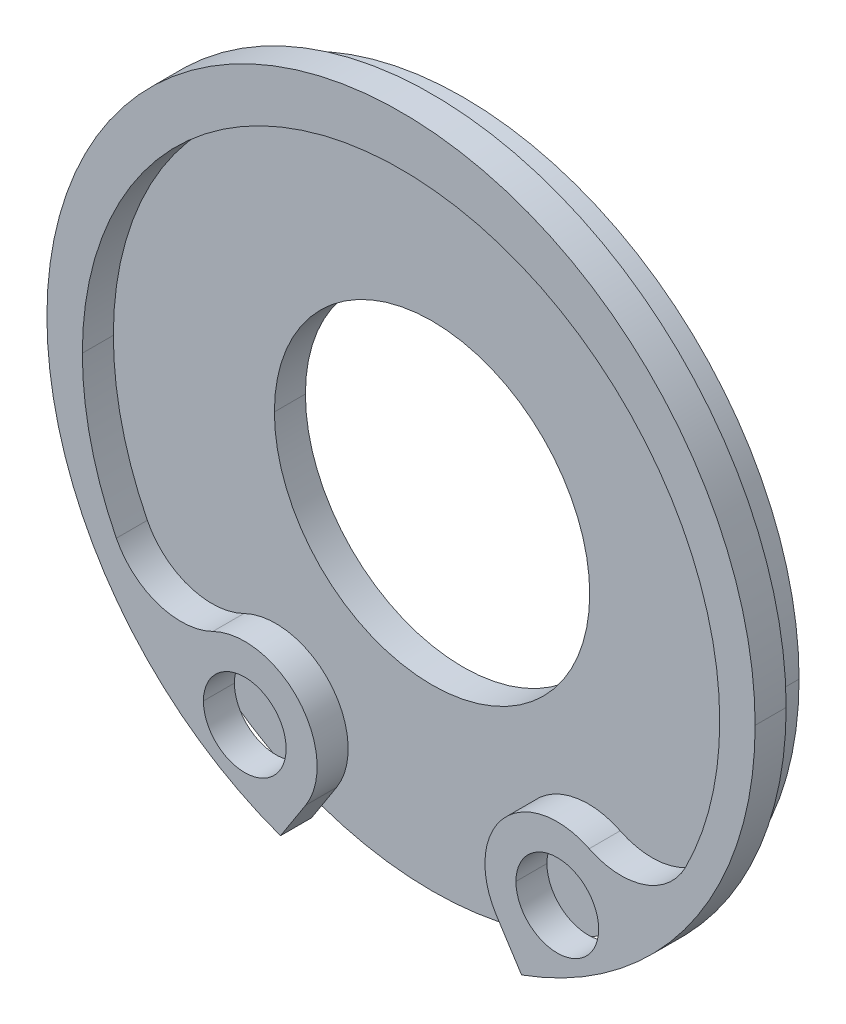
ISO-10303-21;
HEADER;
FILE_DESCRIPTION(('STEP AP214'),'2;1');
FILE_NAME('part.step','',(''),(''),'','','');
FILE_SCHEMA(('AUTOMOTIVE_DESIGN { 1 0 10303 214 1 1 1 1 }'));
ENDSEC;
DATA;
#1=APPLICATION_CONTEXT('core data for automotive mechanical design processes');
#2=APPLICATION_PROTOCOL_DEFINITION('international standard','automotive_design',2000,#1);
#3=PRODUCT_CONTEXT('',#1,'mechanical');
#4=PRODUCT('Part','Part','',(#3));
#5=PRODUCT_RELATED_PRODUCT_CATEGORY('part','',(#4));
#6=PRODUCT_DEFINITION_FORMATION('','',#4);
#7=PRODUCT_DEFINITION_CONTEXT('part definition',#1,'design');
#8=PRODUCT_DEFINITION('design','',#6,#7);
#9=PRODUCT_DEFINITION_SHAPE('','',#8);
#10=(LENGTH_UNIT() NAMED_UNIT(*) SI_UNIT(.MILLI.,.METRE.));
#11=(NAMED_UNIT(*) PLANE_ANGLE_UNIT() SI_UNIT($,.RADIAN.));
#12=(NAMED_UNIT(*) SI_UNIT($,.STERADIAN.) SOLID_ANGLE_UNIT());
#13=UNCERTAINTY_MEASURE_WITH_UNIT(LENGTH_MEASURE(1.E-05),#10,'distance_accuracy_value','');
#14=(GEOMETRIC_REPRESENTATION_CONTEXT(3) GLOBAL_UNCERTAINTY_ASSIGNED_CONTEXT((#13)) GLOBAL_UNIT_ASSIGNED_CONTEXT((#10,
#11,#12)) REPRESENTATION_CONTEXT('',''));
#15=CARTESIAN_POINT('',(0.,0.,0.));
#16=DIRECTION('',(0.,0.,1.));
#17=DIRECTION('',(1.,0.,0.));
#18=AXIS2_PLACEMENT_3D('',#15,#16,#17);
#19=CARTESIAN_POINT('',(0.,0.,26.6));
#20=DIRECTION('',(0.,0.,1.));
#21=DIRECTION('',(1.,0.,0.));
#22=AXIS2_PLACEMENT_3D('',#19,#20,#21);
#23=CYLINDRICAL_SURFACE('',#22,3.05);
#24=CARTESIAN_POINT('',(0.,0.,26.6));
#25=DIRECTION('',(0.,0.,-1.));
#26=DIRECTION('',(-1.,0.,0.));
#27=AXIS2_PLACEMENT_3D('',#24,#25,#26);
#28=CIRCLE('',#27,3.05);
#29=CARTESIAN_POINT('',(3.05,0.,26.6));
#30=VERTEX_POINT('',#29);
#31=CARTESIAN_POINT('',(-3.05,0.,26.6));
#32=VERTEX_POINT('',#31);
#33=EDGE_CURVE('E11',#30,#32,#28,.T.);
#34=ORIENTED_EDGE('',*,*,#33,.T.);
#35=DIRECTION('',(0.,0.,1.));
#36=VECTOR('',#35,1.);
#37=CARTESIAN_POINT('',(-3.05,0.,26.6));
#38=LINE('',#37,#36);
#39=CARTESIAN_POINT('',(-3.05,0.,27.2));
#40=VERTEX_POINT('',#39);
#41=EDGE_CURVE('E27',#32,#40,#38,.T.);
#42=ORIENTED_EDGE('',*,*,#41,.T.);
#43=CARTESIAN_POINT('',(0.,0.,27.2));
#44=DIRECTION('',(0.,0.,-1.));
#45=DIRECTION('',(-1.,0.,0.));
#46=AXIS2_PLACEMENT_3D('',#43,#44,#45);
#47=CIRCLE('',#46,3.05);
#48=CARTESIAN_POINT('',(3.05,0.,27.2));
#49=VERTEX_POINT('',#48);
#50=EDGE_CURVE('E309',#49,#40,#47,.T.);
#51=ORIENTED_EDGE('',*,*,#50,.F.);
#52=DIRECTION('',(0.,0.,1.));
#53=VECTOR('',#52,1.);
#54=CARTESIAN_POINT('',(3.05,0.,26.6));
#55=LINE('',#54,#53);
#56=EDGE_CURVE('E421',#30,#49,#55,.T.);
#57=ORIENTED_EDGE('',*,*,#56,.F.);
#58=EDGE_LOOP('',(#34,#42,#51,#57));
#59=FACE_BOUND('',#58,.T.);
#60=ADVANCED_FACE('F16',(#59),#23,.F.);
#61=CARTESIAN_POINT('',(0.,0.,26.6));
#62=DIRECTION('',(0.,0.,1.));
#63=DIRECTION('',(1.,0.,0.));
#64=AXIS2_PLACEMENT_3D('',#61,#62,#63);
#65=CYLINDRICAL_SURFACE('',#64,6.5);
#66=CARTESIAN_POINT('',(0.,0.,26.6));
#67=DIRECTION('',(0.,0.,-1.));
#68=DIRECTION('',(-1.,0.,0.));
#69=AXIS2_PLACEMENT_3D('',#66,#67,#68);
#70=CIRCLE('',#69,6.5);
#71=CARTESIAN_POINT('',(-6.5,0.,26.6));
#72=VERTEX_POINT('',#71);
#73=CARTESIAN_POINT('',(6.5,0.,26.6));
#74=VERTEX_POINT('',#73);
#75=EDGE_CURVE('E242',#72,#74,#70,.T.);
#76=ORIENTED_EDGE('',*,*,#75,.F.);
#77=DIRECTION('',(0.,0.,1.));
#78=VECTOR('',#77,1.);
#79=CARTESIAN_POINT('',(-6.5,0.,26.6));
#80=LINE('',#79,#78);
#81=CARTESIAN_POINT('',(-6.5,0.,27.2));
#82=VERTEX_POINT('',#81);
#83=EDGE_CURVE('E370',#72,#82,#80,.T.);
#84=ORIENTED_EDGE('',*,*,#83,.T.);
#85=CARTESIAN_POINT('',(0.,0.,27.2));
#86=DIRECTION('',(0.,0.,-1.));
#87=DIRECTION('',(-1.,0.,0.));
#88=AXIS2_PLACEMENT_3D('',#85,#86,#87);
#89=CIRCLE('',#88,6.5);
#90=CARTESIAN_POINT('',(6.5,0.,27.2));
#91=VERTEX_POINT('',#90);
#92=EDGE_CURVE('E435',#82,#91,#89,.T.);
#93=ORIENTED_EDGE('',*,*,#92,.T.);
#94=DIRECTION('',(0.,0.,1.));
#95=VECTOR('',#94,1.);
#96=CARTESIAN_POINT('',(6.5,0.,26.6));
#97=LINE('',#96,#95);
#98=EDGE_CURVE('E374',#74,#91,#97,.T.);
#99=ORIENTED_EDGE('',*,*,#98,.F.);
#100=EDGE_LOOP('',(#76,#84,#93,#99));
#101=FACE_BOUND('',#100,.T.);
#102=ADVANCED_FACE('F583',(#101),#65,.T.);
#103=CARTESIAN_POINT('',(3.02274664433341,-4.9286216520971,27.8));
#104=DIRECTION('',(0.,0.,-1.));
#105=DIRECTION('',(-1.,0.,0.));
#106=AXIS2_PLACEMENT_3D('',#103,#104,#105);
#107=CYLINDRICAL_SURFACE('',#106,0.8);
#108=CARTESIAN_POINT('',(3.02274664433341,-4.9286216520971,27.8));
#109=DIRECTION('',(0.,0.,1.));
#110=DIRECTION('',(-1.,0.,0.));
#111=AXIS2_PLACEMENT_3D('',#108,#109,#110);
#112=CIRCLE('',#111,0.8);
#113=CARTESIAN_POINT('',(2.22274664433341,-4.9286216520971,27.8));
#114=VERTEX_POINT('',#113);
#115=CARTESIAN_POINT('',(3.82274664433341,-4.9286216520971,27.8));
#116=VERTEX_POINT('',#115);
#117=EDGE_CURVE('E286',#114,#116,#112,.T.);
#118=ORIENTED_EDGE('',*,*,#117,.T.);
#119=DIRECTION('',(0.,0.,-1.));
#120=VECTOR('',#119,1.);
#121=CARTESIAN_POINT('',(3.82274664433341,-4.9286216520971,27.8));
#122=LINE('',#121,#120);
#123=CARTESIAN_POINT('',(3.82274664433341,-4.9286216520971,27.2));
#124=VERTEX_POINT('',#123);
#125=EDGE_CURVE('E282',#116,#124,#122,.T.);
#126=ORIENTED_EDGE('',*,*,#125,.T.);
#127=CARTESIAN_POINT('',(3.02274664433341,-4.9286216520971,27.2));
#128=DIRECTION('',(0.,0.,1.));
#129=DIRECTION('',(-1.,0.,0.));
#130=AXIS2_PLACEMENT_3D('',#127,#128,#129);
#131=CIRCLE('',#130,0.8);
#132=CARTESIAN_POINT('',(3.71090570874143,-5.33658868761968,27.2));
#133=VERTEX_POINT('',#132);
#134=EDGE_CURVE('E381',#133,#124,#131,.T.);
#135=ORIENTED_EDGE('',*,*,#134,.F.);
#136=CARTESIAN_POINT('',(3.02274664433341,-4.9286216520971,27.2));
#137=DIRECTION('',(0.,0.,1.));
#138=DIRECTION('',(-1.,0.,0.));
#139=AXIS2_PLACEMENT_3D('',#136,#137,#138);
#140=CIRCLE('',#139,0.8);
#141=CARTESIAN_POINT('',(3.07441502002627,-5.72695139534438,27.2));
#142=VERTEX_POINT('',#141);
#143=EDGE_CURVE('E367',#142,#133,#140,.T.);
#144=ORIENTED_EDGE('',*,*,#143,.F.);
#145=CARTESIAN_POINT('',(3.02274664433341,-4.9286216520971,27.2));
#146=DIRECTION('',(0.,0.,1.));
#147=DIRECTION('',(-1.,0.,0.));
#148=AXIS2_PLACEMENT_3D('',#145,#146,#147);
#149=CIRCLE('',#148,0.8);
#150=CARTESIAN_POINT('',(2.22274664433341,-4.9286216520971,27.2));
#151=VERTEX_POINT('',#150);
#152=EDGE_CURVE('E271',#151,#142,#149,.T.);
#153=ORIENTED_EDGE('',*,*,#152,.F.);
#154=DIRECTION('',(0.,0.,-1.));
#155=VECTOR('',#154,1.);
#156=CARTESIAN_POINT('',(2.22274664433341,-4.9286216520971,27.8));
#157=LINE('',#156,#155);
#158=EDGE_CURVE('E257',#114,#151,#157,.T.);
#159=ORIENTED_EDGE('',*,*,#158,.F.);
#160=EDGE_LOOP('',(#118,#126,#135,#144,#153,#159));
#161=FACE_BOUND('',#160,.T.);
#162=ADVANCED_FACE('F579',(#161),#107,.F.);
#163=CARTESIAN_POINT('',(-3.02274664433341,-4.9286216520971,27.8));
#164=DIRECTION('',(0.,0.,-1.));
#165=DIRECTION('',(-1.,0.,0.));
#166=AXIS2_PLACEMENT_3D('',#163,#164,#165);
#167=CYLINDRICAL_SURFACE('',#166,0.8);
#168=CARTESIAN_POINT('',(-3.02274664433341,-4.9286216520971,27.8));
#169=DIRECTION('',(0.,0.,1.));
#170=DIRECTION('',(1.,0.,0.));
#171=AXIS2_PLACEMENT_3D('',#168,#169,#170);
#172=CIRCLE('',#171,0.8);
#173=CARTESIAN_POINT('',(-3.82274664433341,-4.9286216520971,27.8));
#174=VERTEX_POINT('',#173);
#175=CARTESIAN_POINT('',(-2.22274664433341,-4.9286216520971,27.8));
#176=VERTEX_POINT('',#175);
#177=EDGE_CURVE('E287',#174,#176,#172,.T.);
#178=ORIENTED_EDGE('',*,*,#177,.T.);
#179=DIRECTION('',(0.,0.,-1.));
#180=VECTOR('',#179,1.);
#181=CARTESIAN_POINT('',(-2.22274664433341,-4.9286216520971,27.8));
#182=LINE('',#181,#180);
#183=CARTESIAN_POINT('',(-2.22274664433341,-4.9286216520971,27.2));
#184=VERTEX_POINT('',#183);
#185=EDGE_CURVE('E332',#176,#184,#182,.T.);
#186=ORIENTED_EDGE('',*,*,#185,.T.);
#187=CARTESIAN_POINT('',(-3.02274664433341,-4.9286216520971,27.2));
#188=DIRECTION('',(0.,0.,1.));
#189=DIRECTION('',(1.,0.,0.));
#190=AXIS2_PLACEMENT_3D('',#187,#188,#189);
#191=CIRCLE('',#190,0.8);
#192=CARTESIAN_POINT('',(-3.07441502002627,-5.72695139534438,27.2));
#193=VERTEX_POINT('',#192);
#194=EDGE_CURVE('E341',#193,#184,#191,.T.);
#195=ORIENTED_EDGE('',*,*,#194,.F.);
#196=CARTESIAN_POINT('',(-3.02274664433341,-4.9286216520971,27.2));
#197=DIRECTION('',(0.,0.,1.));
#198=DIRECTION('',(1.,0.,0.));
#199=AXIS2_PLACEMENT_3D('',#196,#197,#198);
#200=CIRCLE('',#199,0.8);
#201=CARTESIAN_POINT('',(-3.71090570874143,-5.33658868761968,27.2));
#202=VERTEX_POINT('',#201);
#203=EDGE_CURVE('E263',#202,#193,#200,.T.);
#204=ORIENTED_EDGE('',*,*,#203,.F.);
#205=CARTESIAN_POINT('',(-3.02274664433341,-4.9286216520971,27.2));
#206=DIRECTION('',(0.,0.,1.));
#207=DIRECTION('',(1.,0.,0.));
#208=AXIS2_PLACEMENT_3D('',#205,#206,#207);
#209=CIRCLE('',#208,0.8);
#210=CARTESIAN_POINT('',(-3.82274664433341,-4.9286216520971,27.2));
#211=VERTEX_POINT('',#210);
#212=EDGE_CURVE('E384',#211,#202,#209,.T.);
#213=ORIENTED_EDGE('',*,*,#212,.F.);
#214=DIRECTION('',(0.,0.,-1.));
#215=VECTOR('',#214,1.);
#216=CARTESIAN_POINT('',(-3.82274664433341,-4.9286216520971,27.8));
#217=LINE('',#216,#215);
#218=EDGE_CURVE('E20',#174,#211,#217,.T.);
#219=ORIENTED_EDGE('',*,*,#218,.F.);
#220=EDGE_LOOP('',(#178,#186,#195,#204,#213,#219));
#221=FACE_BOUND('',#220,.T.);
#222=ADVANCED_FACE('F547',(#221),#167,.F.);
#223=CARTESIAN_POINT('',(0.,0.,27.8));
#224=DIRECTION('',(0.,0.,-1.));
#225=DIRECTION('',(-1.,0.,0.));
#226=AXIS2_PLACEMENT_3D('',#223,#224,#225);
#227=CYLINDRICAL_SURFACE('',#226,6.85);
#228=CARTESIAN_POINT('',(0.,0.,27.8));
#229=DIRECTION('',(0.,0.,1.));
#230=DIRECTION('',(1.,0.,0.));
#231=AXIS2_PLACEMENT_3D('',#228,#229,#230);
#232=CIRCLE('',#231,6.85);
#233=CARTESIAN_POINT('',(6.85,0.,27.8));
#234=VERTEX_POINT('',#233);
#235=CARTESIAN_POINT('',(-6.85,0.,27.8));
#236=VERTEX_POINT('',#235);
#237=EDGE_CURVE('E380',#234,#236,#232,.T.);
#238=ORIENTED_EDGE('',*,*,#237,.F.);
#239=DIRECTION('',(0.,0.,-1.));
#240=VECTOR('',#239,1.);
#241=CARTESIAN_POINT('',(6.85,0.,27.8));
#242=LINE('',#241,#240);
#243=CARTESIAN_POINT('',(6.85,0.,27.2));
#244=VERTEX_POINT('',#243);
#245=EDGE_CURVE('E328',#234,#244,#242,.T.);
#246=ORIENTED_EDGE('',*,*,#245,.T.);
#247=CARTESIAN_POINT('',(0.,0.,27.2));
#248=DIRECTION('',(0.,0.,1.));
#249=DIRECTION('',(1.,0.,0.));
#250=AXIS2_PLACEMENT_3D('',#247,#248,#249);
#251=CIRCLE('',#250,6.85);
#252=CARTESIAN_POINT('',(-6.85,0.,27.2));
#253=VERTEX_POINT('',#252);
#254=EDGE_CURVE('E333',#244,#253,#251,.T.);
#255=ORIENTED_EDGE('',*,*,#254,.T.);
#256=DIRECTION('',(0.,0.,-1.));
#257=VECTOR('',#256,1.);
#258=CARTESIAN_POINT('',(-6.85,0.,27.8));
#259=LINE('',#258,#257);
#260=EDGE_CURVE('E281',#236,#253,#259,.T.);
#261=ORIENTED_EDGE('',*,*,#260,.F.);
#262=EDGE_LOOP('',(#238,#246,#255,#261));
#263=FACE_BOUND('',#262,.T.);
#264=ADVANCED_FACE('F595',(#263),#227,.T.);
#265=CARTESIAN_POINT('',(0.,0.,27.8));
#266=DIRECTION('',(0.,0.,-1.));
#267=DIRECTION('',(-1.,0.,0.));
#268=AXIS2_PLACEMENT_3D('',#265,#266,#267);
#269=CYLINDRICAL_SURFACE('',#268,6.85);
#270=CARTESIAN_POINT('',(0.,0.,27.8));
#271=DIRECTION('',(0.,0.,1.));
#272=DIRECTION('',(1.,0.,0.));
#273=AXIS2_PLACEMENT_3D('',#270,#271,#272);
#274=CIRCLE('',#273,6.85);
#275=CARTESIAN_POINT('',(-2.33180090871575,-6.44090090919837,27.8));
#276=VERTEX_POINT('',#275);
#277=EDGE_CURVE('E340',#236,#276,#274,.T.);
#278=ORIENTED_EDGE('',*,*,#277,.F.);
#279=ORIENTED_EDGE('',*,*,#260,.T.);
#280=CARTESIAN_POINT('',(0.,0.,27.2));
#281=DIRECTION('',(0.,0.,1.));
#282=DIRECTION('',(1.,0.,0.));
#283=AXIS2_PLACEMENT_3D('',#280,#281,#282);
#284=CIRCLE('',#283,6.85);
#285=CARTESIAN_POINT('',(-2.33180090871575,-6.44090090919837,27.2));
#286=VERTEX_POINT('',#285);
#287=EDGE_CURVE('E277',#253,#286,#284,.T.);
#288=ORIENTED_EDGE('',*,*,#287,.T.);
#289=DIRECTION('',(0.,0.,-1.));
#290=VECTOR('',#289,1.);
#291=CARTESIAN_POINT('',(-2.33180090871575,-6.44090090919837,27.8));
#292=LINE('',#291,#290);
#293=EDGE_CURVE('E226',#276,#286,#292,.T.);
#294=ORIENTED_EDGE('',*,*,#293,.F.);
#295=EDGE_LOOP('',(#278,#279,#288,#294));
#296=FACE_BOUND('',#295,.T.);
#297=ADVANCED_FACE('F535',(#296),#269,.T.);
#298=CARTESIAN_POINT('',(3.02274664433341,-4.9286216520971,27.8));
#299=DIRECTION('',(0.,0.,-1.));
#300=DIRECTION('',(-1.,0.,0.));
#301=AXIS2_PLACEMENT_3D('',#298,#299,#300);
#302=CYLINDRICAL_SURFACE('',#301,1.4);
#303=CARTESIAN_POINT('',(3.02274664433341,-4.9286216520971,27.8));
#304=DIRECTION('',(0.,0.,1.));
#305=DIRECTION('',(-1.,0.,0.));
#306=AXIS2_PLACEMENT_3D('',#303,#304,#305);
#307=CIRCLE('',#306,1.4);
#308=CARTESIAN_POINT('',(1.62274664433341,-4.9286216520971,27.8));
#309=VERTEX_POINT('',#308);
#310=CARTESIAN_POINT('',(1.84595339943945,-5.68701314649294,27.8));
#311=VERTEX_POINT('',#310);
#312=EDGE_CURVE('E408',#309,#311,#307,.T.);
#313=ORIENTED_EDGE('',*,*,#312,.F.);
#314=DIRECTION('',(0.,0.,-1.));
#315=VECTOR('',#314,1.);
#316=CARTESIAN_POINT('',(1.62274664433341,-4.9286216520971,27.8));
#317=LINE('',#316,#315);
#318=CARTESIAN_POINT('',(1.62274664433341,-4.9286216520971,27.2));
#319=VERTEX_POINT('',#318);
#320=EDGE_CURVE('E269',#309,#319,#317,.T.);
#321=ORIENTED_EDGE('',*,*,#320,.T.);
#322=CARTESIAN_POINT('',(3.02274664433341,-4.9286216520971,27.2));
#323=DIRECTION('',(0.,0.,1.));
#324=DIRECTION('',(-1.,0.,0.));
#325=AXIS2_PLACEMENT_3D('',#322,#323,#324);
#326=CIRCLE('',#325,1.4);
#327=CARTESIAN_POINT('',(1.84595339943945,-5.68701314649294,27.2));
#328=VERTEX_POINT('',#327);
#329=EDGE_CURVE('E265',#319,#328,#326,.T.);
#330=ORIENTED_EDGE('',*,*,#329,.T.);
#331=DIRECTION('',(0.,0.,-1.));
#332=VECTOR('',#331,1.);
#333=CARTESIAN_POINT('',(1.84595339943945,-5.68701314649294,27.8));
#334=LINE('',#333,#332);
#335=EDGE_CURVE('E308',#311,#328,#334,.T.);
#336=ORIENTED_EDGE('',*,*,#335,.F.);
#337=EDGE_LOOP('',(#313,#321,#330,#336));
#338=FACE_BOUND('',#337,.T.);
#339=ADVANCED_FACE('F594',(#338),#302,.T.);
#340=CARTESIAN_POINT('',(0.,-0.274,27.8));
#341=DIRECTION('',(0.,0.,-1.));
#342=DIRECTION('',(-1.,0.,0.));
#343=AXIS2_PLACEMENT_3D('',#340,#341,#342);
#344=CYLINDRICAL_SURFACE('',#343,6.165);
#345=CARTESIAN_POINT('',(0.,-0.274,27.8));
#346=DIRECTION('',(0.,0.,-1.));
#347=DIRECTION('',(1.,0.,0.));
#348=AXIS2_PLACEMENT_3D('',#345,#346,#347);
#349=CIRCLE('',#348,6.165);
#350=CARTESIAN_POINT('',(6.165,-0.274,27.8));
#351=VERTEX_POINT('',#350);
#352=CARTESIAN_POINT('',(5.50748519476467,-3.04434868373063,27.8));
#353=VERTEX_POINT('',#352);
#354=EDGE_CURVE('E394',#351,#353,#349,.T.);
#355=ORIENTED_EDGE('',*,*,#354,.F.);
#356=DIRECTION('',(0.,0.,-1.));
#357=VECTOR('',#356,1.);
#358=CARTESIAN_POINT('',(6.165,-0.274,27.8));
#359=LINE('',#358,#357);
#360=CARTESIAN_POINT('',(6.165,-0.274,27.2));
#361=VERTEX_POINT('',#360);
#362=EDGE_CURVE('E270',#351,#361,#359,.T.);
#363=ORIENTED_EDGE('',*,*,#362,.T.);
#364=CARTESIAN_POINT('',(0.,-0.274,27.2));
#365=DIRECTION('',(0.,0.,-1.));
#366=DIRECTION('',(1.,0.,0.));
#367=AXIS2_PLACEMENT_3D('',#364,#365,#366);
#368=CIRCLE('',#367,6.165);
#369=CARTESIAN_POINT('',(5.50748519476467,-3.04434868373063,27.2));
#370=VERTEX_POINT('',#369);
#371=EDGE_CURVE('E292',#361,#370,#368,.T.);
#372=ORIENTED_EDGE('',*,*,#371,.T.);
#373=DIRECTION('',(0.,0.,-1.));
#374=VECTOR('',#373,1.);
#375=CARTESIAN_POINT('',(5.50748519476467,-3.04434868373063,27.8));
#376=LINE('',#375,#374);
#377=EDGE_CURVE('E319',#353,#370,#376,.T.);
#378=ORIENTED_EDGE('',*,*,#377,.F.);
#379=EDGE_LOOP('',(#355,#363,#372,#378));
#380=FACE_BOUND('',#379,.T.);
#381=ADVANCED_FACE('F522',(#380),#344,.F.);
#382=CARTESIAN_POINT('',(0.,-0.274,27.8));
#383=DIRECTION('',(0.,0.,-1.));
#384=DIRECTION('',(-1.,0.,0.));
#385=AXIS2_PLACEMENT_3D('',#382,#383,#384);
#386=CYLINDRICAL_SURFACE('',#385,6.165);
#387=ORIENTED_EDGE('',*,*,#362,.F.);
#388=CARTESIAN_POINT('',(0.,-0.274,27.8));
#389=DIRECTION('',(0.,0.,-1.));
#390=DIRECTION('',(1.,0.,0.));
#391=AXIS2_PLACEMENT_3D('',#388,#389,#390);
#392=CIRCLE('',#391,6.165);
#393=CARTESIAN_POINT('',(-6.165,-0.274,27.8));
#394=VERTEX_POINT('',#393);
#395=EDGE_CURVE('E349',#394,#351,#392,.T.);
#396=ORIENTED_EDGE('',*,*,#395,.F.);
#397=DIRECTION('',(0.,0.,-1.));
#398=VECTOR('',#397,1.);
#399=CARTESIAN_POINT('',(-6.165,-0.274,27.8));
#400=LINE('',#399,#398);
#401=CARTESIAN_POINT('',(-6.165,-0.274,27.2));
#402=VERTEX_POINT('',#401);
#403=EDGE_CURVE('E288',#394,#402,#400,.T.);
#404=ORIENTED_EDGE('',*,*,#403,.T.);
#405=CARTESIAN_POINT('',(0.,-0.274,27.2));
#406=DIRECTION('',(0.,0.,-1.));
#407=DIRECTION('',(1.,0.,0.));
#408=AXIS2_PLACEMENT_3D('',#405,#406,#407);
#409=CIRCLE('',#408,6.165);
#410=EDGE_CURVE('E293',#402,#361,#409,.T.);
#411=ORIENTED_EDGE('',*,*,#410,.T.);
#412=EDGE_LOOP('',(#387,#396,#404,#411));
#413=FACE_BOUND('',#412,.T.);
#414=ADVANCED_FACE('F525',(#413),#386,.F.);
#415=CARTESIAN_POINT('',(0.,-0.274,27.8));
#416=DIRECTION('',(0.,0.,1.));
#417=DIRECTION('',(1.,0.,0.));
#418=AXIS2_PLACEMENT_3D('',#415,#416,#417);
#419=PLANE('',#418);
#420=CARTESIAN_POINT('',(0.,-0.274,27.8));
#421=DIRECTION('',(0.,0.,-1.));
#422=DIRECTION('',(1.,0.,0.));
#423=AXIS2_PLACEMENT_3D('',#420,#421,#422);
#424=CIRCLE('',#423,6.165);
#425=CARTESIAN_POINT('',(-5.50748519476467,-3.04434868373063,27.8));
#426=VERTEX_POINT('',#425);
#427=EDGE_CURVE('E345',#426,#394,#424,.T.);
#428=ORIENTED_EDGE('',*,*,#427,.T.);
#429=ORIENTED_EDGE('',*,*,#395,.T.);
#430=ORIENTED_EDGE('',*,*,#354,.T.);
#431=CARTESIAN_POINT('',(4.25679918135501,-2.41523462740899,27.8));
#432=DIRECTION('',(0.,0.,-1.));
#433=DIRECTION('',(-1.,0.,0.));
#434=AXIS2_PLACEMENT_3D('',#431,#432,#433);
#435=CIRCLE('',#434,1.4);
#436=CARTESIAN_POINT('',(3.63977291284421,-3.67192813975305,27.8));
#437=VERTEX_POINT('',#436);
#438=EDGE_CURVE('E398',#353,#437,#435,.T.);
#439=ORIENTED_EDGE('',*,*,#438,.T.);
#440=CARTESIAN_POINT('',(3.02274664433341,-4.9286216520971,27.8));
#441=DIRECTION('',(0.,0.,1.));
#442=DIRECTION('',(-1.,0.,0.));
#443=AXIS2_PLACEMENT_3D('',#440,#441,#442);
#444=CIRCLE('',#443,1.4);
#445=EDGE_CURVE('E414',#437,#309,#444,.T.);
#446=ORIENTED_EDGE('',*,*,#445,.T.);
#447=ORIENTED_EDGE('',*,*,#312,.T.);
#448=DIRECTION('',(0.54170821028274,-0.840566603495685,0.));
#449=VECTOR('',#448,1.);
#450=CARTESIAN_POINT('',(2.33180090871575,-6.44090090919837,27.8));
#451=LINE('',#450,#449);
#452=CARTESIAN_POINT('',(2.33180090871575,-6.44090090919837,27.8));
#453=VERTEX_POINT('',#452);
#454=EDGE_CURVE('E379',#311,#453,#451,.T.);
#455=ORIENTED_EDGE('',*,*,#454,.T.);
#456=CARTESIAN_POINT('',(0.,0.,27.8));
#457=DIRECTION('',(0.,0.,1.));
#458=DIRECTION('',(1.,0.,0.));
#459=AXIS2_PLACEMENT_3D('',#456,#457,#458);
#460=CIRCLE('',#459,6.85);
#461=EDGE_CURVE('E375',#453,#234,#460,.T.);
#462=ORIENTED_EDGE('',*,*,#461,.T.);
#463=ORIENTED_EDGE('',*,*,#237,.T.);
#464=ORIENTED_EDGE('',*,*,#277,.T.);
#465=DIRECTION('',(0.54170821028274,0.840566603495684,0.));
#466=VECTOR('',#465,1.);
#467=CARTESIAN_POINT('',(-2.33180090871575,-6.44090090919837,27.8));
#468=LINE('',#467,#466);
#469=CARTESIAN_POINT('',(-1.84595339943945,-5.68701314649294,27.8));
#470=VERTEX_POINT('',#469);
#471=EDGE_CURVE('E337',#276,#470,#468,.T.);
#472=ORIENTED_EDGE('',*,*,#471,.T.);
#473=CARTESIAN_POINT('',(-3.02274664433341,-4.9286216520971,27.8));
#474=DIRECTION('',(0.,0.,1.));
#475=DIRECTION('',(1.,0.,0.));
#476=AXIS2_PLACEMENT_3D('',#473,#474,#475);
#477=CIRCLE('',#476,1.4);
#478=CARTESIAN_POINT('',(-3.63977291284421,-3.67192813975304,27.8));
#479=VERTEX_POINT('',#478);
#480=EDGE_CURVE('E209',#470,#479,#477,.T.);
#481=ORIENTED_EDGE('',*,*,#480,.T.);
#482=CARTESIAN_POINT('',(-4.25679918135501,-2.41523462740899,27.8));
#483=DIRECTION('',(0.,0.,-1.));
#484=DIRECTION('',(1.,0.,0.));
#485=AXIS2_PLACEMENT_3D('',#482,#483,#484);
#486=CIRCLE('',#485,1.4);
#487=EDGE_CURVE('E364',#479,#426,#486,.T.);
#488=ORIENTED_EDGE('',*,*,#487,.T.);
#489=EDGE_LOOP('',(#428,#429,#430,#439,#446,#447,#455,#462,#463,#464,#472,#481,#488));
#490=FACE_BOUND('',#489,.T.);
#491=ORIENTED_EDGE('',*,*,#177,.F.);
#492=CARTESIAN_POINT('',(-3.02274664433341,-4.9286216520971,27.8));
#493=DIRECTION('',(0.,0.,1.));
#494=DIRECTION('',(1.,0.,0.));
#495=AXIS2_PLACEMENT_3D('',#492,#493,#494);
#496=CIRCLE('',#495,0.8);
#497=EDGE_CURVE('E323',#176,#174,#496,.T.);
#498=ORIENTED_EDGE('',*,*,#497,.F.);
#499=EDGE_LOOP('',(#491,#498));
#500=FACE_BOUND('',#499,.T.);
#501=ORIENTED_EDGE('',*,*,#117,.F.);
#502=CARTESIAN_POINT('',(3.02274664433341,-4.9286216520971,27.8));
#503=DIRECTION('',(0.,0.,1.));
#504=DIRECTION('',(-1.,0.,0.));
#505=AXIS2_PLACEMENT_3D('',#502,#503,#504);
#506=CIRCLE('',#505,0.8);
#507=EDGE_CURVE('E254',#116,#114,#506,.T.);
#508=ORIENTED_EDGE('',*,*,#507,.F.);
#509=EDGE_LOOP('',(#501,#508));
#510=FACE_BOUND('',#509,.T.);
#511=ADVANCED_FACE('F530',(#490,#500,#510),#419,.T.);
#512=CARTESIAN_POINT('',(0.,-0.274,27.2));
#513=DIRECTION('',(0.,0.,1.));
#514=DIRECTION('',(1.,0.,0.));
#515=AXIS2_PLACEMENT_3D('',#512,#513,#514);
#516=PLANE('',#515);
#517=CARTESIAN_POINT('',(0.,0.,27.2));
#518=DIRECTION('',(0.,0.,-1.));
#519=DIRECTION('',(-1.,0.,0.));
#520=AXIS2_PLACEMENT_3D('',#517,#518,#519);
#521=CIRCLE('',#520,6.5);
#522=CARTESIAN_POINT('',(2.13701990029907,-6.13865994706709,27.2));
#523=VERTEX_POINT('',#522);
#524=EDGE_CURVE('E303',#142,#523,#521,.T.);
#525=ORIENTED_EDGE('',*,*,#524,.F.);
#526=ORIENTED_EDGE('',*,*,#143,.T.);
#527=CARTESIAN_POINT('',(0.,0.,27.2));
#528=DIRECTION('',(0.,0.,-1.));
#529=DIRECTION('',(-1.,0.,0.));
#530=AXIS2_PLACEMENT_3D('',#527,#528,#529);
#531=CIRCLE('',#530,6.5);
#532=EDGE_CURVE('E360',#91,#133,#531,.T.);
#533=ORIENTED_EDGE('',*,*,#532,.F.);
#534=ORIENTED_EDGE('',*,*,#92,.F.);
#535=CARTESIAN_POINT('',(0.,0.,27.2));
#536=DIRECTION('',(0.,0.,-1.));
#537=DIRECTION('',(-1.,0.,0.));
#538=AXIS2_PLACEMENT_3D('',#535,#536,#537);
#539=CIRCLE('',#538,6.5);
#540=EDGE_CURVE('E297',#202,#82,#539,.T.);
#541=ORIENTED_EDGE('',*,*,#540,.F.);
#542=ORIENTED_EDGE('',*,*,#203,.T.);
#543=CARTESIAN_POINT('',(0.,0.,27.2));
#544=DIRECTION('',(0.,0.,-1.));
#545=DIRECTION('',(-1.,0.,0.));
#546=AXIS2_PLACEMENT_3D('',#543,#544,#545);
#547=CIRCLE('',#546,6.5);
#548=CARTESIAN_POINT('',(-2.13701990029907,-6.13865994706709,27.2));
#549=VERTEX_POINT('',#548);
#550=EDGE_CURVE('E244',#549,#193,#547,.T.);
#551=ORIENTED_EDGE('',*,*,#550,.F.);
#552=DIRECTION('',(0.54170821028274,0.840566603495684,0.));
#553=VECTOR('',#552,1.);
#554=CARTESIAN_POINT('',(-2.33180090871575,-6.44090090919837,27.2));
#555=LINE('',#554,#553);
#556=EDGE_CURVE('E221',#286,#549,#555,.T.);
#557=ORIENTED_EDGE('',*,*,#556,.F.);
#558=ORIENTED_EDGE('',*,*,#287,.F.);
#559=ORIENTED_EDGE('',*,*,#254,.F.);
#560=CARTESIAN_POINT('',(0.,0.,27.2));
#561=DIRECTION('',(0.,0.,1.));
#562=DIRECTION('',(1.,0.,0.));
#563=AXIS2_PLACEMENT_3D('',#560,#561,#562);
#564=CIRCLE('',#563,6.85);
#565=CARTESIAN_POINT('',(2.33180090871575,-6.44090090919837,27.2));
#566=VERTEX_POINT('',#565);
#567=EDGE_CURVE('E409',#566,#244,#564,.T.);
#568=ORIENTED_EDGE('',*,*,#567,.F.);
#569=DIRECTION('',(0.54170821028274,-0.840566603495685,0.));
#570=VECTOR('',#569,1.);
#571=CARTESIAN_POINT('',(2.33180090871575,-6.44090090919837,27.2));
#572=LINE('',#571,#570);
#573=EDGE_CURVE('E304',#523,#566,#572,.T.);
#574=ORIENTED_EDGE('',*,*,#573,.F.);
#575=EDGE_LOOP('',(#525,#526,#533,#534,#541,#542,#551,#557,#558,#559,#568,#574));
#576=FACE_BOUND('',#575,.T.);
#577=ADVANCED_FACE('F538',(#576),#516,.F.);
#578=CARTESIAN_POINT('',(0.,-0.274,27.8));
#579=DIRECTION('',(0.,0.,-1.));
#580=DIRECTION('',(-1.,0.,0.));
#581=AXIS2_PLACEMENT_3D('',#578,#579,#580);
#582=CYLINDRICAL_SURFACE('',#581,6.165);
#583=ORIENTED_EDGE('',*,*,#403,.F.);
#584=ORIENTED_EDGE('',*,*,#427,.F.);
#585=DIRECTION('',(0.,0.,-1.));
#586=VECTOR('',#585,1.);
#587=CARTESIAN_POINT('',(-5.50748519476467,-3.04434868373063,27.8));
#588=LINE('',#587,#586);
#589=CARTESIAN_POINT('',(-5.50748519476467,-3.04434868373063,27.2));
#590=VERTEX_POINT('',#589);
#591=EDGE_CURVE('E259',#426,#590,#588,.T.);
#592=ORIENTED_EDGE('',*,*,#591,.T.);
#593=CARTESIAN_POINT('',(0.,-0.274,27.2));
#594=DIRECTION('',(0.,0.,-1.));
#595=DIRECTION('',(1.,0.,0.));
#596=AXIS2_PLACEMENT_3D('',#593,#594,#595);
#597=CIRCLE('',#596,6.165);
#598=EDGE_CURVE('E264',#590,#402,#597,.T.);
#599=ORIENTED_EDGE('',*,*,#598,.T.);
#600=EDGE_LOOP('',(#583,#584,#592,#599));
#601=FACE_BOUND('',#600,.T.);
#602=ADVANCED_FACE('F527',(#601),#582,.F.);
#603=CARTESIAN_POINT('',(4.25679918135501,-2.41523462740899,27.8));
#604=DIRECTION('',(0.,0.,-1.));
#605=DIRECTION('',(-1.,0.,0.));
#606=AXIS2_PLACEMENT_3D('',#603,#604,#605);
#607=CYLINDRICAL_SURFACE('',#606,1.4);
#608=CARTESIAN_POINT('',(4.25679918135501,-2.41523462740899,27.2));
#609=DIRECTION('',(0.,0.,-1.));
#610=DIRECTION('',(-1.,0.,0.));
#611=AXIS2_PLACEMENT_3D('',#608,#609,#610);
#612=CIRCLE('',#611,1.4);
#613=CARTESIAN_POINT('',(3.63977291284421,-3.67192813975305,27.2));
#614=VERTEX_POINT('',#613);
#615=EDGE_CURVE('E404',#370,#614,#612,.T.);
#616=ORIENTED_EDGE('',*,*,#615,.T.);
#617=DIRECTION('',(0.,0.,-1.));
#618=VECTOR('',#617,1.);
#619=CARTESIAN_POINT('',(3.63977291284421,-3.67192813975305,27.8));
#620=LINE('',#619,#618);
#621=EDGE_CURVE('E252',#437,#614,#620,.T.);
#622=ORIENTED_EDGE('',*,*,#621,.F.);
#623=ORIENTED_EDGE('',*,*,#438,.F.);
#624=ORIENTED_EDGE('',*,*,#377,.T.);
#625=EDGE_LOOP('',(#616,#622,#623,#624));
#626=FACE_BOUND('',#625,.T.);
#627=ADVANCED_FACE('F787',(#626),#607,.F.);
#628=CARTESIAN_POINT('',(3.02274664433341,-4.9286216520971,27.8));
#629=DIRECTION('',(0.,0.,-1.));
#630=DIRECTION('',(-1.,0.,0.));
#631=AXIS2_PLACEMENT_3D('',#628,#629,#630);
#632=CYLINDRICAL_SURFACE('',#631,1.4);
#633=ORIENTED_EDGE('',*,*,#320,.F.);
#634=ORIENTED_EDGE('',*,*,#445,.F.);
#635=ORIENTED_EDGE('',*,*,#621,.T.);
#636=CARTESIAN_POINT('',(3.02274664433341,-4.9286216520971,27.2));
#637=DIRECTION('',(0.,0.,1.));
#638=DIRECTION('',(-1.,0.,0.));
#639=AXIS2_PLACEMENT_3D('',#636,#637,#638);
#640=CIRCLE('',#639,1.4);
#641=EDGE_CURVE('E248',#614,#319,#640,.T.);
#642=ORIENTED_EDGE('',*,*,#641,.T.);
#643=EDGE_LOOP('',(#633,#634,#635,#642));
#644=FACE_BOUND('',#643,.T.);
#645=ADVANCED_FACE('F18',(#644),#632,.T.);
#646=CARTESIAN_POINT('',(2.33180090871575,-6.44090090919837,27.8));
#647=DIRECTION('',(0.840566603495685,0.54170821028274,0.));
#648=DIRECTION('',(0.,0.,-1.));
#649=AXIS2_PLACEMENT_3D('',#646,#647,#648);
#650=PLANE('',#649);
#651=DIRECTION('',(0.54170821028274,-0.840566603495685,0.));
#652=VECTOR('',#651,1.);
#653=CARTESIAN_POINT('',(2.33180090871575,-6.44090090919837,27.2));
#654=LINE('',#653,#652);
#655=EDGE_CURVE('E253',#328,#523,#654,.T.);
#656=ORIENTED_EDGE('',*,*,#655,.T.);
#657=ORIENTED_EDGE('',*,*,#573,.T.);
#658=DIRECTION('',(0.,0.,-1.));
#659=VECTOR('',#658,1.);
#660=CARTESIAN_POINT('',(2.33180090871575,-6.44090090919837,27.8));
#661=LINE('',#660,#659);
#662=EDGE_CURVE('E412',#453,#566,#661,.T.);
#663=ORIENTED_EDGE('',*,*,#662,.F.);
#664=ORIENTED_EDGE('',*,*,#454,.F.);
#665=ORIENTED_EDGE('',*,*,#335,.T.);
#666=EDGE_LOOP('',(#656,#657,#663,#664,#665));
#667=FACE_BOUND('',#666,.T.);
#668=ADVANCED_FACE('F694',(#667),#650,.F.);
#669=CARTESIAN_POINT('',(0.,0.,27.8));
#670=DIRECTION('',(0.,0.,-1.));
#671=DIRECTION('',(-1.,0.,0.));
#672=AXIS2_PLACEMENT_3D('',#669,#670,#671);
#673=CYLINDRICAL_SURFACE('',#672,6.85);
#674=ORIENTED_EDGE('',*,*,#245,.F.);
#675=ORIENTED_EDGE('',*,*,#461,.F.);
#676=ORIENTED_EDGE('',*,*,#662,.T.);
#677=ORIENTED_EDGE('',*,*,#567,.T.);
#678=EDGE_LOOP('',(#674,#675,#676,#677));
#679=FACE_BOUND('',#678,.T.);
#680=ADVANCED_FACE('F616',(#679),#673,.T.);
#681=CARTESIAN_POINT('',(-2.33180090871575,-6.44090090919837,27.8));
#682=DIRECTION('',(-0.840566603495684,0.54170821028274,0.));
#683=DIRECTION('',(0.,0.,1.));
#684=AXIS2_PLACEMENT_3D('',#681,#682,#683);
#685=PLANE('',#684);
#686=ORIENTED_EDGE('',*,*,#556,.T.);
#687=DIRECTION('',(0.54170821028274,0.840566603495684,0.));
#688=VECTOR('',#687,1.);
#689=CARTESIAN_POINT('',(-2.33180090871575,-6.44090090919837,27.2));
#690=LINE('',#689,#688);
#691=CARTESIAN_POINT('',(-1.84595339943945,-5.68701314649294,27.2));
#692=VERTEX_POINT('',#691);
#693=EDGE_CURVE('E218',#549,#692,#690,.T.);
#694=ORIENTED_EDGE('',*,*,#693,.T.);
#695=DIRECTION('',(0.,0.,-1.));
#696=VECTOR('',#695,1.);
#697=CARTESIAN_POINT('',(-1.84595339943945,-5.68701314649294,27.8));
#698=LINE('',#697,#696);
#699=EDGE_CURVE('E201',#470,#692,#698,.T.);
#700=ORIENTED_EDGE('',*,*,#699,.F.);
#701=ORIENTED_EDGE('',*,*,#471,.F.);
#702=ORIENTED_EDGE('',*,*,#293,.T.);
#703=EDGE_LOOP('',(#686,#694,#700,#701,#702));
#704=FACE_BOUND('',#703,.T.);
#705=ADVANCED_FACE('F219',(#704),#685,.F.);
#706=CARTESIAN_POINT('',(-3.02274664433341,-4.9286216520971,27.8));
#707=DIRECTION('',(0.,0.,-1.));
#708=DIRECTION('',(-1.,0.,0.));
#709=AXIS2_PLACEMENT_3D('',#706,#707,#708);
#710=CYLINDRICAL_SURFACE('',#709,1.4);
#711=CARTESIAN_POINT('',(-3.02274664433341,-4.9286216520971,27.2));
#712=DIRECTION('',(0.,0.,1.));
#713=DIRECTION('',(1.,0.,0.));
#714=AXIS2_PLACEMENT_3D('',#711,#712,#713);
#715=CIRCLE('',#714,1.4);
#716=CARTESIAN_POINT('',(-3.63977291284421,-3.67192813975304,27.2));
#717=VERTEX_POINT('',#716);
#718=EDGE_CURVE('E206',#692,#717,#715,.T.);
#719=ORIENTED_EDGE('',*,*,#718,.T.);
#720=DIRECTION('',(0.,0.,-1.));
#721=VECTOR('',#720,1.);
#722=CARTESIAN_POINT('',(-3.63977291284421,-3.67192813975304,27.8));
#723=LINE('',#722,#721);
#724=EDGE_CURVE('E327',#479,#717,#723,.T.);
#725=ORIENTED_EDGE('',*,*,#724,.F.);
#726=ORIENTED_EDGE('',*,*,#480,.F.);
#727=ORIENTED_EDGE('',*,*,#699,.T.);
#728=EDGE_LOOP('',(#719,#725,#726,#727));
#729=FACE_BOUND('',#728,.T.);
#730=ADVANCED_FACE('F203',(#729),#710,.T.);
#731=CARTESIAN_POINT('',(-4.25679918135501,-2.41523462740899,27.8));
#732=DIRECTION('',(0.,0.,-1.));
#733=DIRECTION('',(-1.,0.,0.));
#734=AXIS2_PLACEMENT_3D('',#731,#732,#733);
#735=CYLINDRICAL_SURFACE('',#734,1.4);
#736=CARTESIAN_POINT('',(-4.25679918135501,-2.41523462740899,27.2));
#737=DIRECTION('',(0.,0.,-1.));
#738=DIRECTION('',(1.,0.,0.));
#739=AXIS2_PLACEMENT_3D('',#736,#737,#738);
#740=CIRCLE('',#739,1.4);
#741=EDGE_CURVE('E214',#717,#590,#740,.T.);
#742=ORIENTED_EDGE('',*,*,#741,.T.);
#743=ORIENTED_EDGE('',*,*,#591,.F.);
#744=ORIENTED_EDGE('',*,*,#487,.F.);
#745=ORIENTED_EDGE('',*,*,#724,.T.);
#746=EDGE_LOOP('',(#742,#743,#744,#745));
#747=FACE_BOUND('',#746,.T.);
#748=ADVANCED_FACE('F502',(#747),#735,.F.);
#749=CARTESIAN_POINT('',(-3.02274664433341,-4.9286216520971,27.8));
#750=DIRECTION('',(0.,0.,-1.));
#751=DIRECTION('',(-1.,0.,0.));
#752=AXIS2_PLACEMENT_3D('',#749,#750,#751);
#753=CYLINDRICAL_SURFACE('',#752,0.8);
#754=ORIENTED_EDGE('',*,*,#185,.F.);
#755=ORIENTED_EDGE('',*,*,#497,.T.);
#756=ORIENTED_EDGE('',*,*,#218,.T.);
#757=CARTESIAN_POINT('',(-3.02274664433341,-4.9286216520971,27.2));
#758=DIRECTION('',(0.,0.,1.));
#759=DIRECTION('',(1.,0.,0.));
#760=AXIS2_PLACEMENT_3D('',#757,#758,#759);
#761=CIRCLE('',#760,0.8);
#762=EDGE_CURVE('E344',#184,#211,#761,.T.);
#763=ORIENTED_EDGE('',*,*,#762,.F.);
#764=EDGE_LOOP('',(#754,#755,#756,#763));
#765=FACE_BOUND('',#764,.T.);
#766=ADVANCED_FACE('F558',(#765),#753,.F.);
#767=CARTESIAN_POINT('',(3.02274664433341,-4.9286216520971,27.8));
#768=DIRECTION('',(0.,0.,-1.));
#769=DIRECTION('',(-1.,0.,0.));
#770=AXIS2_PLACEMENT_3D('',#767,#768,#769);
#771=CYLINDRICAL_SURFACE('',#770,0.8);
#772=ORIENTED_EDGE('',*,*,#125,.F.);
#773=ORIENTED_EDGE('',*,*,#507,.T.);
#774=ORIENTED_EDGE('',*,*,#158,.T.);
#775=CARTESIAN_POINT('',(3.02274664433341,-4.9286216520971,27.2));
#776=DIRECTION('',(0.,0.,1.));
#777=DIRECTION('',(-1.,0.,0.));
#778=AXIS2_PLACEMENT_3D('',#775,#776,#777);
#779=CIRCLE('',#778,0.8);
#780=EDGE_CURVE('E275',#124,#151,#779,.T.);
#781=ORIENTED_EDGE('',*,*,#780,.F.);
#782=EDGE_LOOP('',(#772,#773,#774,#781));
#783=FACE_BOUND('',#782,.T.);
#784=ADVANCED_FACE('F602',(#783),#771,.F.);
#785=CARTESIAN_POINT('',(0.,0.,27.2));
#786=DIRECTION('',(0.,0.,-1.));
#787=DIRECTION('',(0.,-1.,0.));
#788=AXIS2_PLACEMENT_3D('',#785,#786,#787);
#789=PLANE('',#788);
#790=CARTESIAN_POINT('',(0.,0.,27.2));
#791=DIRECTION('',(0.,0.,-1.));
#792=DIRECTION('',(-1.,0.,0.));
#793=AXIS2_PLACEMENT_3D('',#790,#791,#792);
#794=CIRCLE('',#793,6.5);
#795=EDGE_CURVE('E247',#193,#202,#794,.T.);
#796=ORIENTED_EDGE('',*,*,#795,.F.);
#797=ORIENTED_EDGE('',*,*,#194,.T.);
#798=ORIENTED_EDGE('',*,*,#762,.T.);
#799=ORIENTED_EDGE('',*,*,#212,.T.);
#800=EDGE_LOOP('',(#796,#797,#798,#799));
#801=FACE_BOUND('',#800,.T.);
#802=ADVANCED_FACE('F551',(#801),#789,.F.);
#803=CARTESIAN_POINT('',(0.,0.,27.2));
#804=DIRECTION('',(0.,0.,-1.));
#805=DIRECTION('',(0.,-1.,0.));
#806=AXIS2_PLACEMENT_3D('',#803,#804,#805);
#807=PLANE('',#806);
#808=CARTESIAN_POINT('',(0.,0.,27.2));
#809=DIRECTION('',(0.,0.,-1.));
#810=DIRECTION('',(-1.,0.,0.));
#811=AXIS2_PLACEMENT_3D('',#808,#809,#810);
#812=CIRCLE('',#811,6.5);
#813=EDGE_CURVE('E356',#133,#142,#812,.T.);
#814=ORIENTED_EDGE('',*,*,#813,.F.);
#815=ORIENTED_EDGE('',*,*,#134,.T.);
#816=ORIENTED_EDGE('',*,*,#780,.T.);
#817=ORIENTED_EDGE('',*,*,#152,.T.);
#818=EDGE_LOOP('',(#814,#815,#816,#817));
#819=FACE_BOUND('',#818,.T.);
#820=ADVANCED_FACE('F645',(#819),#807,.F.);
#821=CARTESIAN_POINT('',(0.,0.,26.6));
#822=DIRECTION('',(0.,0.,-1.));
#823=DIRECTION('',(0.,-1.,0.));
#824=AXIS2_PLACEMENT_3D('',#821,#822,#823);
#825=PLANE('',#824);
#826=CARTESIAN_POINT('',(0.,0.,26.6));
#827=DIRECTION('',(0.,0.,-1.));
#828=DIRECTION('',(-1.,0.,0.));
#829=AXIS2_PLACEMENT_3D('',#826,#827,#828);
#830=CIRCLE('',#829,6.5);
#831=EDGE_CURVE('E276',#74,#72,#830,.T.);
#832=ORIENTED_EDGE('',*,*,#831,.T.);
#833=ORIENTED_EDGE('',*,*,#75,.T.);
#834=EDGE_LOOP('',(#832,#833));
#835=FACE_BOUND('',#834,.T.);
#836=ORIENTED_EDGE('',*,*,#33,.F.);
#837=CARTESIAN_POINT('',(0.,0.,26.6));
#838=DIRECTION('',(0.,0.,-1.));
#839=DIRECTION('',(-1.,0.,0.));
#840=AXIS2_PLACEMENT_3D('',#837,#838,#839);
#841=CIRCLE('',#840,3.05);
#842=EDGE_CURVE('E316',#32,#30,#841,.T.);
#843=ORIENTED_EDGE('',*,*,#842,.F.);
#844=EDGE_LOOP('',(#836,#843));
#845=FACE_BOUND('',#844,.T.);
#846=ADVANCED_FACE('F664',(#835,#845),#825,.T.);
#847=CARTESIAN_POINT('',(0.,0.,27.2));
#848=DIRECTION('',(0.,0.,-1.));
#849=DIRECTION('',(0.,-1.,0.));
#850=AXIS2_PLACEMENT_3D('',#847,#848,#849);
#851=PLANE('',#850);
#852=ORIENTED_EDGE('',*,*,#693,.F.);
#853=CARTESIAN_POINT('',(0.,0.,27.2));
#854=DIRECTION('',(0.,0.,-1.));
#855=DIRECTION('',(-1.,0.,0.));
#856=AXIS2_PLACEMENT_3D('',#853,#854,#855);
#857=CIRCLE('',#856,6.5);
#858=EDGE_CURVE('E246',#523,#549,#857,.T.);
#859=ORIENTED_EDGE('',*,*,#858,.F.);
#860=ORIENTED_EDGE('',*,*,#655,.F.);
#861=ORIENTED_EDGE('',*,*,#329,.F.);
#862=ORIENTED_EDGE('',*,*,#641,.F.);
#863=ORIENTED_EDGE('',*,*,#615,.F.);
#864=ORIENTED_EDGE('',*,*,#371,.F.);
#865=ORIENTED_EDGE('',*,*,#410,.F.);
#866=ORIENTED_EDGE('',*,*,#598,.F.);
#867=ORIENTED_EDGE('',*,*,#741,.F.);
#868=ORIENTED_EDGE('',*,*,#718,.F.);
#869=EDGE_LOOP('',(#852,#859,#860,#861,#862,#863,#864,#865,#866,#867,#868));
#870=FACE_BOUND('',#869,.T.);
#871=ORIENTED_EDGE('',*,*,#50,.T.);
#872=CARTESIAN_POINT('',(0.,0.,27.2));
#873=DIRECTION('',(0.,0.,-1.));
#874=DIRECTION('',(-1.,0.,0.));
#875=AXIS2_PLACEMENT_3D('',#872,#873,#874);
#876=CIRCLE('',#875,3.05);
#877=EDGE_CURVE('E312',#40,#49,#876,.T.);
#878=ORIENTED_EDGE('',*,*,#877,.T.);
#879=EDGE_LOOP('',(#871,#878));
#880=FACE_BOUND('',#879,.T.);
#881=ADVANCED_FACE('F228',(#870,#880),#851,.F.);
#882=CARTESIAN_POINT('',(0.,0.,26.6));
#883=DIRECTION('',(0.,0.,1.));
#884=DIRECTION('',(1.,0.,0.));
#885=AXIS2_PLACEMENT_3D('',#882,#883,#884);
#886=CYLINDRICAL_SURFACE('',#885,6.5);
#887=ORIENTED_EDGE('',*,*,#83,.F.);
#888=ORIENTED_EDGE('',*,*,#831,.F.);
#889=ORIENTED_EDGE('',*,*,#98,.T.);
#890=ORIENTED_EDGE('',*,*,#532,.T.);
#891=ORIENTED_EDGE('',*,*,#813,.T.);
#892=ORIENTED_EDGE('',*,*,#524,.T.);
#893=ORIENTED_EDGE('',*,*,#858,.T.);
#894=ORIENTED_EDGE('',*,*,#550,.T.);
#895=ORIENTED_EDGE('',*,*,#795,.T.);
#896=ORIENTED_EDGE('',*,*,#540,.T.);
#897=EDGE_LOOP('',(#887,#888,#889,#890,#891,#892,#893,#894,#895,#896));
#898=FACE_BOUND('',#897,.T.);
#899=ADVANCED_FACE('F545',(#898),#886,.T.);
#900=CARTESIAN_POINT('',(0.,0.,26.6));
#901=DIRECTION('',(0.,0.,1.));
#902=DIRECTION('',(1.,0.,0.));
#903=AXIS2_PLACEMENT_3D('',#900,#901,#902);
#904=CYLINDRICAL_SURFACE('',#903,3.05);
#905=ORIENTED_EDGE('',*,*,#41,.F.);
#906=ORIENTED_EDGE('',*,*,#842,.T.);
#907=ORIENTED_EDGE('',*,*,#56,.T.);
#908=ORIENTED_EDGE('',*,*,#877,.F.);
#909=EDGE_LOOP('',(#905,#906,#907,#908));
#910=FACE_BOUND('',#909,.T.);
#911=ADVANCED_FACE('F715',(#910),#904,.F.);
#912=CLOSED_SHELL('',(#60,#102,#162,#222,#264,#297,#339,#381,#414,#511,#577,#602,#627,#645,#668,
#680,#705,#730,#748,#766,#784,#802,#820,#846,#881,#899,#911));
#913=MANIFOLD_SOLID_BREP('B1',#912);
#914=ADVANCED_BREP_SHAPE_REPRESENTATION('',(#18,#913),#14);
#915=SHAPE_DEFINITION_REPRESENTATION(#9,#914);
ENDSEC;
END-ISO-10303-21;
